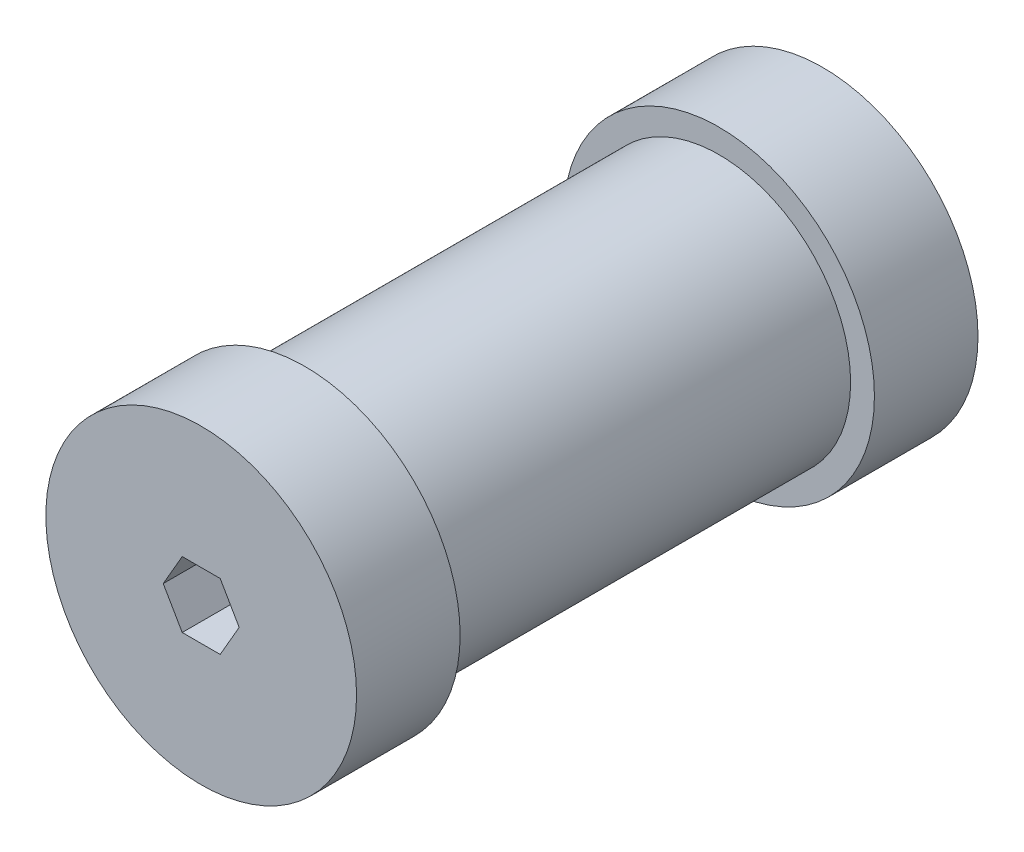
ISO-10303-21;
HEADER;
FILE_DESCRIPTION(('STEP AP214'),'2;1');
FILE_NAME('part.step','',(''),(''),'','','');
FILE_SCHEMA(('AUTOMOTIVE_DESIGN { 1 0 10303 214 1 1 1 1 }'));
ENDSEC;
DATA;
#1=APPLICATION_CONTEXT('core data for automotive mechanical design processes');
#2=APPLICATION_PROTOCOL_DEFINITION('international standard','automotive_design',2000,#1);
#3=PRODUCT_CONTEXT('',#1,'mechanical');
#4=PRODUCT('Part','Part','',(#3));
#5=PRODUCT_RELATED_PRODUCT_CATEGORY('part','',(#4));
#6=PRODUCT_DEFINITION_FORMATION('','',#4);
#7=PRODUCT_DEFINITION_CONTEXT('part definition',#1,'design');
#8=PRODUCT_DEFINITION('design','',#6,#7);
#9=PRODUCT_DEFINITION_SHAPE('','',#8);
#10=(LENGTH_UNIT() NAMED_UNIT(*) SI_UNIT(.MILLI.,.METRE.));
#11=(NAMED_UNIT(*) PLANE_ANGLE_UNIT() SI_UNIT($,.RADIAN.));
#12=(NAMED_UNIT(*) SI_UNIT($,.STERADIAN.) SOLID_ANGLE_UNIT());
#13=UNCERTAINTY_MEASURE_WITH_UNIT(LENGTH_MEASURE(1.E-05),#10,'distance_accuracy_value','');
#14=(GEOMETRIC_REPRESENTATION_CONTEXT(3) GLOBAL_UNCERTAINTY_ASSIGNED_CONTEXT((#13)) GLOBAL_UNIT_ASSIGNED_CONTEXT((#10,
#11,#12)) REPRESENTATION_CONTEXT('',''));
#15=CARTESIAN_POINT('',(0.,0.,0.));
#16=DIRECTION('',(0.,0.,1.));
#17=DIRECTION('',(1.,0.,0.));
#18=AXIS2_PLACEMENT_3D('',#15,#16,#17);
#19=CARTESIAN_POINT('',(0.,0.,-55.3932584269663));
#20=DIRECTION('',(0.,0.,1.));
#21=DIRECTION('',(1.,0.,0.));
#22=AXIS2_PLACEMENT_3D('',#19,#20,#21);
#23=PLANE('',#22);
#24=DIRECTION('',(0.5,0.866025403784439,0.));
#25=VECTOR('',#24,1.);
#26=CARTESIAN_POINT('',(-7.33234841870825,0.,-55.3932584269663));
#27=LINE('',#26,#25);
#28=CARTESIAN_POINT('',(-7.33234841870825,0.,-55.3932584269663));
#29=VERTEX_POINT('',#28);
#30=CARTESIAN_POINT('',(-3.66617420935412,6.35,-55.3932584269663));
#31=VERTEX_POINT('',#30);
#32=EDGE_CURVE('E134',#29,#31,#27,.T.);
#33=ORIENTED_EDGE('',*,*,#32,.F.);
#34=DIRECTION('',(-0.5,0.866025403784439,0.));
#35=VECTOR('',#34,1.);
#36=CARTESIAN_POINT('',(-3.66617420935413,-6.35,-55.3932584269663));
#37=LINE('',#36,#35);
#38=CARTESIAN_POINT('',(-3.66617420935413,-6.35,-55.3932584269663));
#39=VERTEX_POINT('',#38);
#40=EDGE_CURVE('E54',#39,#29,#37,.T.);
#41=ORIENTED_EDGE('',*,*,#40,.F.);
#42=DIRECTION('',(-1.,0.,0.));
#43=VECTOR('',#42,1.);
#44=CARTESIAN_POINT('',(3.66617420935412,-6.35,-55.3932584269663));
#45=LINE('',#44,#43);
#46=CARTESIAN_POINT('',(3.66617420935412,-6.35,-55.3932584269663));
#47=VERTEX_POINT('',#46);
#48=EDGE_CURVE('E114',#47,#39,#45,.T.);
#49=ORIENTED_EDGE('',*,*,#48,.F.);
#50=DIRECTION('',(-0.5,-0.866025403784439,0.));
#51=VECTOR('',#50,1.);
#52=CARTESIAN_POINT('',(7.33234841870824,0.,-55.3932584269663));
#53=LINE('',#52,#51);
#54=CARTESIAN_POINT('',(7.33234841870824,0.,-55.3932584269663));
#55=VERTEX_POINT('',#54);
#56=EDGE_CURVE('E118',#55,#47,#53,.T.);
#57=ORIENTED_EDGE('',*,*,#56,.F.);
#58=DIRECTION('',(0.5,-0.866025403784438,0.));
#59=VECTOR('',#58,1.);
#60=CARTESIAN_POINT('',(3.66617420935411,6.35,-55.3932584269663));
#61=LINE('',#60,#59);
#62=CARTESIAN_POINT('',(3.66617420935411,6.35,-55.3932584269663));
#63=VERTEX_POINT('',#62);
#64=EDGE_CURVE('E141',#63,#55,#61,.T.);
#65=ORIENTED_EDGE('',*,*,#64,.F.);
#66=DIRECTION('',(1.,0.,0.));
#67=VECTOR('',#66,1.);
#68=CARTESIAN_POINT('',(-3.66617420935412,6.35,-55.3932584269663));
#69=LINE('',#68,#67);
#70=EDGE_CURVE('E137',#31,#63,#69,.T.);
#71=ORIENTED_EDGE('',*,*,#70,.F.);
#72=EDGE_LOOP('',(#33,#41,#49,#57,#65,#71));
#73=FACE_BOUND('',#72,.T.);
#74=CARTESIAN_POINT('',(0.,0.,-55.3932584269663));
#75=DIRECTION('',(0.,0.,1.));
#76=DIRECTION('',(1.,0.,0.));
#77=AXIS2_PLACEMENT_3D('',#74,#75,#76);
#78=CIRCLE('',#77,30.);
#79=CARTESIAN_POINT('',(30.,0.,-55.3932584269663));
#80=VERTEX_POINT('',#79);
#81=EDGE_CURVE('E11',#80,#80,#78,.T.);
#82=ORIENTED_EDGE('',*,*,#81,.F.);
#83=EDGE_LOOP('',(#82));
#84=FACE_BOUND('',#83,.T.);
#85=ADVANCED_FACE('F39',(#73,#84),#23,.F.);
#86=CARTESIAN_POINT('',(0.,0.,64.6067415730337));
#87=DIRECTION('',(0.,0.,1.));
#88=DIRECTION('',(1.,0.,0.));
#89=AXIS2_PLACEMENT_3D('',#86,#87,#88);
#90=CYLINDRICAL_SURFACE('',#89,30.);
#91=CARTESIAN_POINT('',(0.,0.,-35.3932584269663));
#92=DIRECTION('',(0.,0.,1.));
#93=DIRECTION('',(1.,0.,0.));
#94=AXIS2_PLACEMENT_3D('',#91,#92,#93);
#95=CIRCLE('',#94,30.);
#96=CARTESIAN_POINT('',(30.,0.,-35.3932584269663));
#97=VERTEX_POINT('',#96);
#98=EDGE_CURVE('E47',#97,#97,#95,.T.);
#99=ORIENTED_EDGE('',*,*,#98,.F.);
#100=EDGE_LOOP('',(#99));
#101=FACE_BOUND('',#100,.T.);
#102=ORIENTED_EDGE('',*,*,#81,.T.);
#103=EDGE_LOOP('',(#102));
#104=FACE_BOUND('',#103,.T.);
#105=ADVANCED_FACE('F183',(#101,#104),#90,.T.);
#106=CARTESIAN_POINT('',(-30.,0.,-35.3932584269663));
#107=DIRECTION('',(0.,0.,-1.));
#108=DIRECTION('',(-1.,0.,0.));
#109=AXIS2_PLACEMENT_3D('',#106,#107,#108);
#110=PLANE('',#109);
#111=CARTESIAN_POINT('',(0.,0.,-35.3932584269663));
#112=DIRECTION('',(0.,0.,1.));
#113=DIRECTION('',(1.,0.,0.));
#114=AXIS2_PLACEMENT_3D('',#111,#112,#113);
#115=CIRCLE('',#114,25.4);
#116=CARTESIAN_POINT('',(25.4,0.,-35.3932584269663));
#117=VERTEX_POINT('',#116);
#118=EDGE_CURVE('E174',#117,#117,#115,.T.);
#119=ORIENTED_EDGE('',*,*,#118,.F.);
#120=EDGE_LOOP('',(#119));
#121=FACE_BOUND('',#120,.T.);
#122=ORIENTED_EDGE('',*,*,#98,.T.);
#123=EDGE_LOOP('',(#122));
#124=FACE_BOUND('',#123,.T.);
#125=ADVANCED_FACE('F181',(#121,#124),#110,.F.);
#126=CARTESIAN_POINT('',(0.,0.,64.6067415730337));
#127=DIRECTION('',(0.,0.,1.));
#128=DIRECTION('',(1.,0.,0.));
#129=AXIS2_PLACEMENT_3D('',#126,#127,#128);
#130=CYLINDRICAL_SURFACE('',#129,25.4);
#131=CARTESIAN_POINT('',(0.,0.,44.6067415730337));
#132=DIRECTION('',(0.,0.,1.));
#133=DIRECTION('',(1.,0.,0.));
#134=AXIS2_PLACEMENT_3D('',#131,#132,#133);
#135=CIRCLE('',#134,25.4);
#136=CARTESIAN_POINT('',(25.4,0.,44.6067415730337));
#137=VERTEX_POINT('',#136);
#138=EDGE_CURVE('E170',#137,#137,#135,.T.);
#139=ORIENTED_EDGE('',*,*,#138,.F.);
#140=EDGE_LOOP('',(#139));
#141=FACE_BOUND('',#140,.T.);
#142=ORIENTED_EDGE('',*,*,#118,.T.);
#143=EDGE_LOOP('',(#142));
#144=FACE_BOUND('',#143,.T.);
#145=ADVANCED_FACE('F229',(#141,#144),#130,.T.);
#146=CARTESIAN_POINT('',(-25.4,0.,44.6067415730337));
#147=DIRECTION('',(0.,0.,1.));
#148=DIRECTION('',(1.,0.,0.));
#149=AXIS2_PLACEMENT_3D('',#146,#147,#148);
#150=PLANE('',#149);
#151=CARTESIAN_POINT('',(0.,0.,44.6067415730337));
#152=DIRECTION('',(0.,0.,1.));
#153=DIRECTION('',(1.,0.,0.));
#154=AXIS2_PLACEMENT_3D('',#151,#152,#153);
#155=CIRCLE('',#154,30.);
#156=CARTESIAN_POINT('',(30.,0.,44.6067415730337));
#157=VERTEX_POINT('',#156);
#158=EDGE_CURVE('E166',#157,#157,#155,.T.);
#159=ORIENTED_EDGE('',*,*,#158,.F.);
#160=EDGE_LOOP('',(#159));
#161=FACE_BOUND('',#160,.T.);
#162=ORIENTED_EDGE('',*,*,#138,.T.);
#163=EDGE_LOOP('',(#162));
#164=FACE_BOUND('',#163,.T.);
#165=ADVANCED_FACE('F225',(#161,#164),#150,.F.);
#166=CARTESIAN_POINT('',(0.,0.,64.6067415730337));
#167=DIRECTION('',(0.,0.,1.));
#168=DIRECTION('',(1.,0.,0.));
#169=AXIS2_PLACEMENT_3D('',#166,#167,#168);
#170=CYLINDRICAL_SURFACE('',#169,30.);
#171=CARTESIAN_POINT('',(0.,0.,64.6067415730337));
#172=DIRECTION('',(0.,0.,1.));
#173=DIRECTION('',(1.,0.,0.));
#174=AXIS2_PLACEMENT_3D('',#171,#172,#173);
#175=CIRCLE('',#174,30.);
#176=CARTESIAN_POINT('',(30.,0.,64.6067415730337));
#177=VERTEX_POINT('',#176);
#178=EDGE_CURVE('E151',#177,#177,#175,.T.);
#179=ORIENTED_EDGE('',*,*,#178,.F.);
#180=EDGE_LOOP('',(#179));
#181=FACE_BOUND('',#180,.T.);
#182=ORIENTED_EDGE('',*,*,#158,.T.);
#183=EDGE_LOOP('',(#182));
#184=FACE_BOUND('',#183,.T.);
#185=ADVANCED_FACE('F222',(#181,#184),#170,.T.);
#186=CARTESIAN_POINT('',(-30.,0.,64.6067415730337));
#187=DIRECTION('',(0.,0.,-1.));
#188=DIRECTION('',(-1.,0.,0.));
#189=AXIS2_PLACEMENT_3D('',#186,#187,#188);
#190=PLANE('',#189);
#191=DIRECTION('',(-1.,0.,0.));
#192=VECTOR('',#191,1.);
#193=CARTESIAN_POINT('',(3.66617420935413,-6.35,64.6067415730337));
#194=LINE('',#193,#192);
#195=CARTESIAN_POINT('',(3.66617420935413,-6.35,64.6067415730337));
#196=VERTEX_POINT('',#195);
#197=CARTESIAN_POINT('',(-3.66617420935411,-6.35,64.6067415730337));
#198=VERTEX_POINT('',#197);
#199=EDGE_CURVE('E101',#196,#198,#194,.T.);
#200=ORIENTED_EDGE('',*,*,#199,.T.);
#201=DIRECTION('',(-0.5,0.866025403784439,0.));
#202=VECTOR('',#201,1.);
#203=CARTESIAN_POINT('',(-3.66617420935411,-6.35,64.6067415730337));
#204=LINE('',#203,#202);
#205=CARTESIAN_POINT('',(-7.33234841870823,0.,64.6067415730337));
#206=VERTEX_POINT('',#205);
#207=EDGE_CURVE('E94',#198,#206,#204,.T.);
#208=ORIENTED_EDGE('',*,*,#207,.T.);
#209=DIRECTION('',(0.5,0.866025403784439,0.));
#210=VECTOR('',#209,1.);
#211=CARTESIAN_POINT('',(-7.33234841870823,0.,64.6067415730337));
#212=LINE('',#211,#210);
#213=CARTESIAN_POINT('',(-3.66617420935411,6.35,64.6067415730337));
#214=VERTEX_POINT('',#213);
#215=EDGE_CURVE('E104',#206,#214,#212,.T.);
#216=ORIENTED_EDGE('',*,*,#215,.T.);
#217=DIRECTION('',(1.,0.,0.));
#218=VECTOR('',#217,1.);
#219=CARTESIAN_POINT('',(-3.66617420935411,6.35,64.6067415730337));
#220=LINE('',#219,#218);
#221=CARTESIAN_POINT('',(3.66617420935413,6.35,64.6067415730337));
#222=VERTEX_POINT('',#221);
#223=EDGE_CURVE('E62',#214,#222,#220,.T.);
#224=ORIENTED_EDGE('',*,*,#223,.T.);
#225=DIRECTION('',(0.5,-0.866025403784438,0.));
#226=VECTOR('',#225,1.);
#227=CARTESIAN_POINT('',(3.66617420935413,6.35,64.6067415730337));
#228=LINE('',#227,#226);
#229=CARTESIAN_POINT('',(7.33234841870826,0.,64.6067415730337));
#230=VERTEX_POINT('',#229);
#231=EDGE_CURVE('E123',#222,#230,#228,.T.);
#232=ORIENTED_EDGE('',*,*,#231,.T.);
#233=DIRECTION('',(-0.5,-0.866025403784439,0.));
#234=VECTOR('',#233,1.);
#235=CARTESIAN_POINT('',(7.33234841870826,0.,64.6067415730337));
#236=LINE('',#235,#234);
#237=EDGE_CURVE('E127',#230,#196,#236,.T.);
#238=ORIENTED_EDGE('',*,*,#237,.T.);
#239=EDGE_LOOP('',(#200,#208,#216,#224,#232,#238));
#240=FACE_BOUND('',#239,.T.);
#241=ORIENTED_EDGE('',*,*,#178,.T.);
#242=EDGE_LOOP('',(#241));
#243=FACE_BOUND('',#242,.T.);
#244=ADVANCED_FACE('F109',(#240,#243),#190,.F.);
#245=CARTESIAN_POINT('',(-3.66617420935411,-6.35,64.6067415730337));
#246=DIRECTION('',(-0.866025403784439,-0.5,0.));
#247=DIRECTION('',(0.5,-0.866025403784439,0.));
#248=AXIS2_PLACEMENT_3D('',#245,#246,#247);
#249=PLANE('',#248);
#250=ORIENTED_EDGE('',*,*,#40,.T.);
#251=DIRECTION('',(0.,0.,-1.));
#252=VECTOR('',#251,1.);
#253=CARTESIAN_POINT('',(-7.33234841870823,0.,64.6067415730337));
#254=LINE('',#253,#252);
#255=EDGE_CURVE('E90',#206,#29,#254,.T.);
#256=ORIENTED_EDGE('',*,*,#255,.F.);
#257=ORIENTED_EDGE('',*,*,#207,.F.);
#258=DIRECTION('',(0.,0.,-1.));
#259=VECTOR('',#258,1.);
#260=CARTESIAN_POINT('',(-3.66617420935411,-6.35,64.6067415730337));
#261=LINE('',#260,#259);
#262=EDGE_CURVE('E148',#198,#39,#261,.T.);
#263=ORIENTED_EDGE('',*,*,#262,.T.);
#264=EDGE_LOOP('',(#250,#256,#257,#263));
#265=FACE_BOUND('',#264,.T.);
#266=ADVANCED_FACE('F92',(#265),#249,.F.);
#267=CARTESIAN_POINT('',(3.66617420935413,-6.35,64.6067415730337));
#268=DIRECTION('',(0.,-1.,0.));
#269=DIRECTION('',(1.,0.,0.));
#270=AXIS2_PLACEMENT_3D('',#267,#268,#269);
#271=PLANE('',#270);
#272=ORIENTED_EDGE('',*,*,#48,.T.);
#273=ORIENTED_EDGE('',*,*,#262,.F.);
#274=ORIENTED_EDGE('',*,*,#199,.F.);
#275=DIRECTION('',(0.,0.,-1.));
#276=VECTOR('',#275,1.);
#277=CARTESIAN_POINT('',(3.66617420935413,-6.35,64.6067415730337));
#278=LINE('',#277,#276);
#279=EDGE_CURVE('E152',#196,#47,#278,.T.);
#280=ORIENTED_EDGE('',*,*,#279,.T.);
#281=EDGE_LOOP('',(#272,#273,#274,#280));
#282=FACE_BOUND('',#281,.T.);
#283=ADVANCED_FACE('F204',(#282),#271,.F.);
#284=CARTESIAN_POINT('',(7.33234841870826,0.,64.6067415730337));
#285=DIRECTION('',(0.866025403784439,-0.5,0.));
#286=DIRECTION('',(0.5,0.866025403784439,0.));
#287=AXIS2_PLACEMENT_3D('',#284,#285,#286);
#288=PLANE('',#287);
#289=ORIENTED_EDGE('',*,*,#56,.T.);
#290=ORIENTED_EDGE('',*,*,#279,.F.);
#291=ORIENTED_EDGE('',*,*,#237,.F.);
#292=DIRECTION('',(0.,0.,-1.));
#293=VECTOR('',#292,1.);
#294=CARTESIAN_POINT('',(7.33234841870826,0.,64.6067415730337));
#295=LINE('',#294,#293);
#296=EDGE_CURVE('E155',#230,#55,#295,.T.);
#297=ORIENTED_EDGE('',*,*,#296,.T.);
#298=EDGE_LOOP('',(#289,#290,#291,#297));
#299=FACE_BOUND('',#298,.T.);
#300=ADVANCED_FACE('F202',(#299),#288,.F.);
#301=CARTESIAN_POINT('',(3.66617420935413,6.35,64.6067415730337));
#302=DIRECTION('',(0.866025403784438,0.5,0.));
#303=DIRECTION('',(-0.5,0.866025403784438,0.));
#304=AXIS2_PLACEMENT_3D('',#301,#302,#303);
#305=PLANE('',#304);
#306=ORIENTED_EDGE('',*,*,#64,.T.);
#307=ORIENTED_EDGE('',*,*,#296,.F.);
#308=ORIENTED_EDGE('',*,*,#231,.F.);
#309=DIRECTION('',(0.,0.,-1.));
#310=VECTOR('',#309,1.);
#311=CARTESIAN_POINT('',(3.66617420935413,6.35,64.6067415730337));
#312=LINE('',#311,#310);
#313=EDGE_CURVE('E158',#222,#63,#312,.T.);
#314=ORIENTED_EDGE('',*,*,#313,.T.);
#315=EDGE_LOOP('',(#306,#307,#308,#314));
#316=FACE_BOUND('',#315,.T.);
#317=ADVANCED_FACE('F199',(#316),#305,.F.);
#318=CARTESIAN_POINT('',(-3.66617420935411,6.35,64.6067415730337));
#319=DIRECTION('',(0.,1.,0.));
#320=DIRECTION('',(-1.,0.,0.));
#321=AXIS2_PLACEMENT_3D('',#318,#319,#320);
#322=PLANE('',#321);
#323=ORIENTED_EDGE('',*,*,#70,.T.);
#324=ORIENTED_EDGE('',*,*,#313,.F.);
#325=ORIENTED_EDGE('',*,*,#223,.F.);
#326=DIRECTION('',(0.,0.,-1.));
#327=VECTOR('',#326,1.);
#328=CARTESIAN_POINT('',(-3.66617420935411,6.35,64.6067415730337));
#329=LINE('',#328,#327);
#330=EDGE_CURVE('E100',#214,#31,#329,.T.);
#331=ORIENTED_EDGE('',*,*,#330,.T.);
#332=EDGE_LOOP('',(#323,#324,#325,#331));
#333=FACE_BOUND('',#332,.T.);
#334=ADVANCED_FACE('F196',(#333),#322,.F.);
#335=CARTESIAN_POINT('',(-7.33234841870823,0.,64.6067415730337));
#336=DIRECTION('',(-0.866025403784439,0.5,0.));
#337=DIRECTION('',(-0.5,-0.866025403784439,0.));
#338=AXIS2_PLACEMENT_3D('',#335,#336,#337);
#339=PLANE('',#338);
#340=ORIENTED_EDGE('',*,*,#32,.T.);
#341=ORIENTED_EDGE('',*,*,#330,.F.);
#342=ORIENTED_EDGE('',*,*,#215,.F.);
#343=ORIENTED_EDGE('',*,*,#255,.T.);
#344=EDGE_LOOP('',(#340,#341,#342,#343));
#345=FACE_BOUND('',#344,.T.);
#346=ADVANCED_FACE('F105',(#345),#339,.F.);
#347=CLOSED_SHELL('',(#85,#105,#125,#145,#165,#185,#244,#266,#283,#300,#317,#334,#346));
#348=MANIFOLD_SOLID_BREP('B2',#347);
#349=ADVANCED_BREP_SHAPE_REPRESENTATION('',(#18,#348),#14);
#350=SHAPE_DEFINITION_REPRESENTATION(#9,#349);
ENDSEC;
END-ISO-10303-21;
